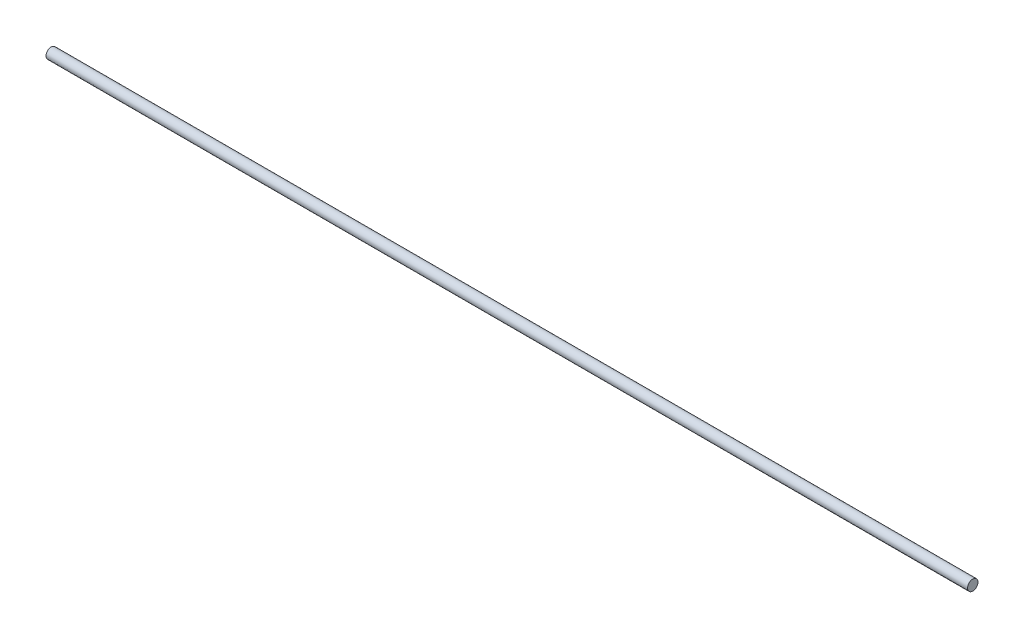
ISO-10303-21;
HEADER;
FILE_DESCRIPTION(('STEP AP214'),'2;1');
FILE_NAME('part.step','',(''),(''),'','','');
FILE_SCHEMA(('AUTOMOTIVE_DESIGN { 1 0 10303 214 1 1 1 1 }'));
ENDSEC;
DATA;
#1=APPLICATION_CONTEXT('core data for automotive mechanical design processes');
#2=APPLICATION_PROTOCOL_DEFINITION('international standard','automotive_design',2000,#1);
#3=PRODUCT_CONTEXT('',#1,'mechanical');
#4=PRODUCT('Part','Part','',(#3));
#5=PRODUCT_RELATED_PRODUCT_CATEGORY('part','',(#4));
#6=PRODUCT_DEFINITION_FORMATION('','',#4);
#7=PRODUCT_DEFINITION_CONTEXT('part definition',#1,'design');
#8=PRODUCT_DEFINITION('design','',#6,#7);
#9=PRODUCT_DEFINITION_SHAPE('','',#8);
#10=(LENGTH_UNIT() NAMED_UNIT(*) SI_UNIT(.MILLI.,.METRE.));
#11=(NAMED_UNIT(*) PLANE_ANGLE_UNIT() SI_UNIT($,.RADIAN.));
#12=(NAMED_UNIT(*) SI_UNIT($,.STERADIAN.) SOLID_ANGLE_UNIT());
#13=UNCERTAINTY_MEASURE_WITH_UNIT(LENGTH_MEASURE(1.E-05),#10,'distance_accuracy_value','');
#14=(GEOMETRIC_REPRESENTATION_CONTEXT(3) GLOBAL_UNCERTAINTY_ASSIGNED_CONTEXT((#13)) GLOBAL_UNIT_ASSIGNED_CONTEXT((#10,
#11,#12)) REPRESENTATION_CONTEXT('',''));
#15=CARTESIAN_POINT('',(0.,0.,0.));
#16=DIRECTION('',(0.,0.,1.));
#17=DIRECTION('',(1.,0.,0.));
#18=AXIS2_PLACEMENT_3D('',#15,#16,#17);
#19=CARTESIAN_POINT('',(-1122.1376259541,0.,0.));
#20=DIRECTION('',(1.,0.,0.));
#21=DIRECTION('',(0.,0.,-1.));
#22=AXIS2_PLACEMENT_3D('',#19,#20,#21);
#23=CYLINDRICAL_SURFACE('',#22,6.35);
#24=CARTESIAN_POINT('',(-1122.1376259541,0.,0.));
#25=DIRECTION('',(1.,0.,0.));
#26=DIRECTION('',(0.,0.,-1.));
#27=AXIS2_PLACEMENT_3D('',#24,#25,#26);
#28=CIRCLE('',#27,6.35);
#29=CARTESIAN_POINT('',(-1122.1376259541,0.,-6.35));
#30=VERTEX_POINT('',#29);
#31=EDGE_CURVE('E10',#30,#30,#28,.T.);
#32=ORIENTED_EDGE('',*,*,#31,.T.);
#33=EDGE_LOOP('',(#32));
#34=FACE_BOUND('',#33,.T.);
#35=CARTESIAN_POINT('',(0.,0.,0.));
#36=DIRECTION('',(1.,0.,0.));
#37=DIRECTION('',(0.,0.,-1.));
#38=AXIS2_PLACEMENT_3D('',#35,#36,#37);
#39=CIRCLE('',#38,6.35);
#40=CARTESIAN_POINT('',(0.,0.,-6.35));
#41=VERTEX_POINT('',#40);
#42=EDGE_CURVE('E46',#41,#41,#39,.T.);
#43=ORIENTED_EDGE('',*,*,#42,.F.);
#44=EDGE_LOOP('',(#43));
#45=FACE_BOUND('',#44,.T.);
#46=ADVANCED_FACE('F43',(#34,#45),#23,.T.);
#47=CARTESIAN_POINT('',(-1122.1376259541,0.,0.));
#48=DIRECTION('',(1.,0.,0.));
#49=DIRECTION('',(0.,0.,-1.));
#50=AXIS2_PLACEMENT_3D('',#47,#48,#49);
#51=PLANE('',#50);
#52=ORIENTED_EDGE('',*,*,#31,.F.);
#53=EDGE_LOOP('',(#52));
#54=FACE_BOUND('',#53,.T.);
#55=ADVANCED_FACE('F59',(#54),#51,.F.);
#56=CARTESIAN_POINT('',(0.,0.,0.));
#57=DIRECTION('',(1.,0.,0.));
#58=DIRECTION('',(0.,0.,-1.));
#59=AXIS2_PLACEMENT_3D('',#56,#57,#58);
#60=PLANE('',#59);
#61=ORIENTED_EDGE('',*,*,#42,.T.);
#62=EDGE_LOOP('',(#61));
#63=FACE_BOUND('',#62,.T.);
#64=ADVANCED_FACE('F54',(#63),#60,.T.);
#65=CLOSED_SHELL('',(#46,#55,#64));
#66=MANIFOLD_SOLID_BREP('B2',#65);
#67=ADVANCED_BREP_SHAPE_REPRESENTATION('',(#18,#66),#14);
#68=SHAPE_DEFINITION_REPRESENTATION(#9,#67);
ENDSEC;
END-ISO-10303-21;
